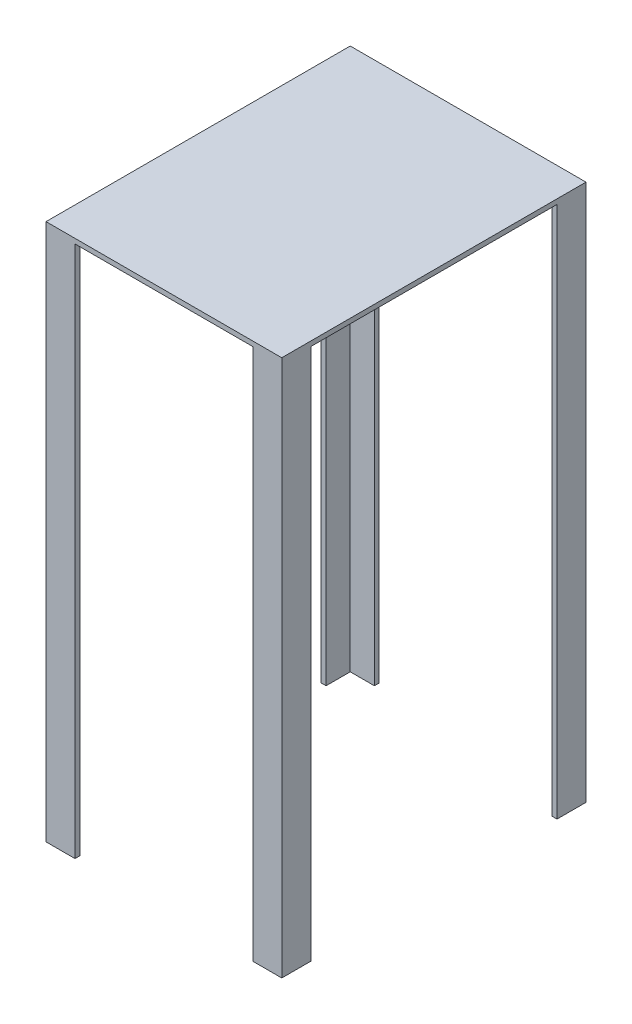
ISO-10303-21;
HEADER;
FILE_DESCRIPTION(('STEP AP214'),'2;1');
FILE_NAME('part.step','',(''),(''),'','','');
FILE_SCHEMA(('AUTOMOTIVE_DESIGN { 1 0 10303 214 1 1 1 1 }'));
ENDSEC;
DATA;
#1=APPLICATION_CONTEXT('core data for automotive mechanical design processes');
#2=APPLICATION_PROTOCOL_DEFINITION('international standard','automotive_design',2000,#1);
#3=PRODUCT_CONTEXT('',#1,'mechanical');
#4=PRODUCT('Part','Part','',(#3));
#5=PRODUCT_RELATED_PRODUCT_CATEGORY('part','',(#4));
#6=PRODUCT_DEFINITION_FORMATION('','',#4);
#7=PRODUCT_DEFINITION_CONTEXT('part definition',#1,'design');
#8=PRODUCT_DEFINITION('design','',#6,#7);
#9=PRODUCT_DEFINITION_SHAPE('','',#8);
#10=(LENGTH_UNIT() NAMED_UNIT(*) SI_UNIT(.MILLI.,.METRE.));
#11=(NAMED_UNIT(*) PLANE_ANGLE_UNIT() SI_UNIT($,.RADIAN.));
#12=(NAMED_UNIT(*) SI_UNIT($,.STERADIAN.) SOLID_ANGLE_UNIT());
#13=UNCERTAINTY_MEASURE_WITH_UNIT(LENGTH_MEASURE(1.E-05),#10,'distance_accuracy_value','');
#14=(GEOMETRIC_REPRESENTATION_CONTEXT(3) GLOBAL_UNCERTAINTY_ASSIGNED_CONTEXT((#13)) GLOBAL_UNIT_ASSIGNED_CONTEXT((#10,
#11,#12)) REPRESENTATION_CONTEXT('',''));
#15=CARTESIAN_POINT('',(0.,0.,0.));
#16=DIRECTION('',(0.,0.,1.));
#17=DIRECTION('',(1.,0.,0.));
#18=AXIS2_PLACEMENT_3D('',#15,#16,#17);
#19=CARTESIAN_POINT('',(0.,-6.35,0.));
#20=DIRECTION('',(0.,-1.,0.));
#21=DIRECTION('',(0.,0.,-1.));
#22=AXIS2_PLACEMENT_3D('',#19,#20,#21);
#23=PLANE('',#22);
#24=DIRECTION('',(-1.,0.,0.));
#25=VECTOR('',#24,1.);
#26=CARTESIAN_POINT('',(6.35,-6.35,-393.65));
#27=LINE('',#26,#25);
#28=CARTESIAN_POINT('',(38.1,-6.35,-393.65));
#29=VERTEX_POINT('',#28);
#30=CARTESIAN_POINT('',(6.35,-6.35,-393.65));
#31=VERTEX_POINT('',#30);
#32=EDGE_CURVE('E383',#29,#31,#27,.T.);
#33=ORIENTED_EDGE('',*,*,#32,.F.);
#34=DIRECTION('',(0.,0.,1.));
#35=VECTOR('',#34,1.);
#36=CARTESIAN_POINT('',(38.1,-6.35,-393.65));
#37=LINE('',#36,#35);
#38=CARTESIAN_POINT('',(38.1,-6.35,-400.));
#39=VERTEX_POINT('',#38);
#40=EDGE_CURVE('E381',#39,#29,#37,.T.);
#41=ORIENTED_EDGE('',*,*,#40,.F.);
#42=DIRECTION('',(-1.,0.,0.));
#43=VECTOR('',#42,1.);
#44=CARTESIAN_POINT('',(0.,-6.35,-400.));
#45=LINE('',#44,#43);
#46=CARTESIAN_POINT('',(271.9,-6.35,-400.));
#47=VERTEX_POINT('',#46);
#48=EDGE_CURVE('E222',#47,#39,#45,.T.);
#49=ORIENTED_EDGE('',*,*,#48,.F.);
#50=DIRECTION('',(0.,0.,-1.));
#51=VECTOR('',#50,1.);
#52=CARTESIAN_POINT('',(271.9,-6.35,-393.65));
#53=LINE('',#52,#51);
#54=CARTESIAN_POINT('',(271.9,-6.35,-393.65));
#55=VERTEX_POINT('',#54);
#56=EDGE_CURVE('E235',#55,#47,#53,.T.);
#57=ORIENTED_EDGE('',*,*,#56,.F.);
#58=DIRECTION('',(-1.,0.,0.));
#59=VECTOR('',#58,1.);
#60=CARTESIAN_POINT('',(303.65,-6.35,-393.65));
#61=LINE('',#60,#59);
#62=CARTESIAN_POINT('',(303.65,-6.35,-393.65));
#63=VERTEX_POINT('',#62);
#64=EDGE_CURVE('E248',#63,#55,#61,.T.);
#65=ORIENTED_EDGE('',*,*,#64,.F.);
#66=DIRECTION('',(0.,0.,-1.));
#67=VECTOR('',#66,1.);
#68=CARTESIAN_POINT('',(303.65,-6.35,-393.65));
#69=LINE('',#68,#67);
#70=CARTESIAN_POINT('',(303.65,-6.35,-361.9));
#71=VERTEX_POINT('',#70);
#72=EDGE_CURVE('E225',#71,#63,#69,.T.);
#73=ORIENTED_EDGE('',*,*,#72,.F.);
#74=DIRECTION('',(-1.,0.,0.));
#75=VECTOR('',#74,1.);
#76=CARTESIAN_POINT('',(303.65,-6.35,-361.9));
#77=LINE('',#76,#75);
#78=CARTESIAN_POINT('',(310.,-6.35,-361.9));
#79=VERTEX_POINT('',#78);
#80=EDGE_CURVE('E223',#79,#71,#77,.T.);
#81=ORIENTED_EDGE('',*,*,#80,.F.);
#82=DIRECTION('',(0.,0.,-1.));
#83=VECTOR('',#82,1.);
#84=CARTESIAN_POINT('',(310.,-6.35,0.));
#85=LINE('',#84,#83);
#86=CARTESIAN_POINT('',(310.,-6.35,-38.1));
#87=VERTEX_POINT('',#86);
#88=EDGE_CURVE('E342',#87,#79,#85,.T.);
#89=ORIENTED_EDGE('',*,*,#88,.F.);
#90=DIRECTION('',(1.,0.,0.));
#91=VECTOR('',#90,1.);
#92=CARTESIAN_POINT('',(303.65,-6.35,-38.1));
#93=LINE('',#92,#91);
#94=CARTESIAN_POINT('',(303.65,-6.35,-38.1));
#95=VERTEX_POINT('',#94);
#96=EDGE_CURVE('E268',#95,#87,#93,.T.);
#97=ORIENTED_EDGE('',*,*,#96,.F.);
#98=DIRECTION('',(0.,0.,-1.));
#99=VECTOR('',#98,1.);
#100=CARTESIAN_POINT('',(303.65,-6.35,-6.35));
#101=LINE('',#100,#99);
#102=CARTESIAN_POINT('',(303.65,-6.35,-6.35));
#103=VERTEX_POINT('',#102);
#104=EDGE_CURVE('E282',#103,#95,#101,.T.);
#105=ORIENTED_EDGE('',*,*,#104,.F.);
#106=DIRECTION('',(1.,0.,0.));
#107=VECTOR('',#106,1.);
#108=CARTESIAN_POINT('',(303.65,-6.35,-6.35));
#109=LINE('',#108,#107);
#110=CARTESIAN_POINT('',(271.9,-6.35,-6.35));
#111=VERTEX_POINT('',#110);
#112=EDGE_CURVE('E280',#111,#103,#109,.T.);
#113=ORIENTED_EDGE('',*,*,#112,.F.);
#114=DIRECTION('',(0.,0.,-1.));
#115=VECTOR('',#114,1.);
#116=CARTESIAN_POINT('',(271.9,-6.35,-6.35));
#117=LINE('',#116,#115);
#118=CARTESIAN_POINT('',(271.9,-6.35,0.));
#119=VERTEX_POINT('',#118);
#120=EDGE_CURVE('E263',#119,#111,#117,.T.);
#121=ORIENTED_EDGE('',*,*,#120,.F.);
#122=DIRECTION('',(1.,0.,0.));
#123=VECTOR('',#122,1.);
#124=CARTESIAN_POINT('',(0.,-6.35,0.));
#125=LINE('',#124,#123);
#126=CARTESIAN_POINT('',(38.1,-6.35,0.));
#127=VERTEX_POINT('',#126);
#128=EDGE_CURVE('E338',#127,#119,#125,.T.);
#129=ORIENTED_EDGE('',*,*,#128,.F.);
#130=DIRECTION('',(0.,0.,1.));
#131=VECTOR('',#130,1.);
#132=CARTESIAN_POINT('',(38.1,-6.35,-6.35));
#133=LINE('',#132,#131);
#134=CARTESIAN_POINT('',(38.1,-6.35,-6.35));
#135=VERTEX_POINT('',#134);
#136=EDGE_CURVE('E58',#135,#127,#133,.T.);
#137=ORIENTED_EDGE('',*,*,#136,.F.);
#138=DIRECTION('',(1.,0.,0.));
#139=VECTOR('',#138,1.);
#140=CARTESIAN_POINT('',(6.35,-6.35,-6.35));
#141=LINE('',#140,#139);
#142=CARTESIAN_POINT('',(6.35,-6.35,-6.35));
#143=VERTEX_POINT('',#142);
#144=EDGE_CURVE('E318',#143,#135,#141,.T.);
#145=ORIENTED_EDGE('',*,*,#144,.F.);
#146=DIRECTION('',(0.,0.,1.));
#147=VECTOR('',#146,1.);
#148=CARTESIAN_POINT('',(6.35,-6.35,-6.35));
#149=LINE('',#148,#147);
#150=CARTESIAN_POINT('',(6.35,-6.35,-38.1));
#151=VERTEX_POINT('',#150);
#152=EDGE_CURVE('E315',#151,#143,#149,.T.);
#153=ORIENTED_EDGE('',*,*,#152,.F.);
#154=DIRECTION('',(1.,0.,0.));
#155=VECTOR('',#154,1.);
#156=CARTESIAN_POINT('',(6.35,-6.35,-38.1));
#157=LINE('',#156,#155);
#158=CARTESIAN_POINT('',(0.,-6.35,-38.1));
#159=VERTEX_POINT('',#158);
#160=EDGE_CURVE('E297',#159,#151,#157,.T.);
#161=ORIENTED_EDGE('',*,*,#160,.F.);
#162=DIRECTION('',(0.,0.,1.));
#163=VECTOR('',#162,1.);
#164=CARTESIAN_POINT('',(0.,-6.35,0.));
#165=LINE('',#164,#163);
#166=CARTESIAN_POINT('',(0.,-6.35,-361.9));
#167=VERTEX_POINT('',#166);
#168=EDGE_CURVE('E336',#167,#159,#165,.T.);
#169=ORIENTED_EDGE('',*,*,#168,.F.);
#170=DIRECTION('',(-1.,0.,0.));
#171=VECTOR('',#170,1.);
#172=CARTESIAN_POINT('',(6.35,-6.35,-361.9));
#173=LINE('',#172,#171);
#174=CARTESIAN_POINT('',(6.35,-6.35,-361.9));
#175=VERTEX_POINT('',#174);
#176=EDGE_CURVE('E215',#175,#167,#173,.T.);
#177=ORIENTED_EDGE('',*,*,#176,.F.);
#178=DIRECTION('',(0.,0.,1.));
#179=VECTOR('',#178,1.);
#180=CARTESIAN_POINT('',(6.35,-6.35,-393.65));
#181=LINE('',#180,#179);
#182=EDGE_CURVE('E385',#31,#175,#181,.T.);
#183=ORIENTED_EDGE('',*,*,#182,.F.);
#184=EDGE_LOOP('',(#33,#41,#49,#57,#65,#73,#81,#89,#97,#105,#113,#121,#129,#137,#145,#153,#161,
#169,#177,#183));
#185=FACE_BOUND('',#184,.T.);
#186=ADVANCED_FACE('F33',(#185),#23,.T.);
#187=CARTESIAN_POINT('',(0.,-6.35,0.));
#188=DIRECTION('',(-1.,0.,0.));
#189=DIRECTION('',(0.,0.,1.));
#190=AXIS2_PLACEMENT_3D('',#187,#188,#189);
#191=PLANE('',#190);
#192=DIRECTION('',(0.,0.,1.));
#193=VECTOR('',#192,1.);
#194=CARTESIAN_POINT('',(0.,0.,0.));
#195=LINE('',#194,#193);
#196=CARTESIAN_POINT('',(0.,0.,-400.));
#197=VERTEX_POINT('',#196);
#198=CARTESIAN_POINT('',(0.,0.,0.));
#199=VERTEX_POINT('',#198);
#200=EDGE_CURVE('E335',#197,#199,#195,.T.);
#201=ORIENTED_EDGE('',*,*,#200,.F.);
#202=DIRECTION('',(0.,1.,0.));
#203=VECTOR('',#202,1.);
#204=CARTESIAN_POINT('',(0.,-6.35,-400.));
#205=LINE('',#204,#203);
#206=CARTESIAN_POINT('',(0.,-706.35,-400.));
#207=VERTEX_POINT('',#206);
#208=EDGE_CURVE('E11',#207,#197,#205,.T.);
#209=ORIENTED_EDGE('',*,*,#208,.F.);
#210=DIRECTION('',(0.,0.,-1.));
#211=VECTOR('',#210,1.);
#212=CARTESIAN_POINT('',(0.,-706.35,-400.));
#213=LINE('',#212,#211);
#214=CARTESIAN_POINT('',(0.,-706.35,-361.9));
#215=VERTEX_POINT('',#214);
#216=EDGE_CURVE('E213',#215,#207,#213,.T.);
#217=ORIENTED_EDGE('',*,*,#216,.F.);
#218=DIRECTION('',(0.,1.,0.));
#219=VECTOR('',#218,1.);
#220=CARTESIAN_POINT('',(0.,-706.35,-361.9));
#221=LINE('',#220,#219);
#222=EDGE_CURVE('E371',#215,#167,#221,.T.);
#223=ORIENTED_EDGE('',*,*,#222,.T.);
#224=ORIENTED_EDGE('',*,*,#168,.T.);
#225=DIRECTION('',(0.,1.,0.));
#226=VECTOR('',#225,1.);
#227=CARTESIAN_POINT('',(0.,-706.35,-38.1));
#228=LINE('',#227,#226);
#229=CARTESIAN_POINT('',(0.,-706.35,-38.1));
#230=VERTEX_POINT('',#229);
#231=EDGE_CURVE('E332',#230,#159,#228,.T.);
#232=ORIENTED_EDGE('',*,*,#231,.F.);
#233=DIRECTION('',(0.,0.,-1.));
#234=VECTOR('',#233,1.);
#235=CARTESIAN_POINT('',(0.,-706.35,0.));
#236=LINE('',#235,#234);
#237=CARTESIAN_POINT('',(0.,-706.35,0.));
#238=VERTEX_POINT('',#237);
#239=EDGE_CURVE('E298',#238,#230,#236,.T.);
#240=ORIENTED_EDGE('',*,*,#239,.F.);
#241=DIRECTION('',(0.,1.,0.));
#242=VECTOR('',#241,1.);
#243=CARTESIAN_POINT('',(0.,-6.35,0.));
#244=LINE('',#243,#242);
#245=EDGE_CURVE('E37',#238,#199,#244,.T.);
#246=ORIENTED_EDGE('',*,*,#245,.T.);
#247=EDGE_LOOP('',(#201,#209,#217,#223,#224,#232,#240,#246));
#248=FACE_BOUND('',#247,.T.);
#249=ADVANCED_FACE('F35',(#248),#191,.T.);
#250=CARTESIAN_POINT('',(0.,-6.35,-400.));
#251=DIRECTION('',(0.,0.,-1.));
#252=DIRECTION('',(-1.,0.,0.));
#253=AXIS2_PLACEMENT_3D('',#250,#251,#252);
#254=PLANE('',#253);
#255=DIRECTION('',(-1.,0.,0.));
#256=VECTOR('',#255,1.);
#257=CARTESIAN_POINT('',(0.,0.,-400.));
#258=LINE('',#257,#256);
#259=CARTESIAN_POINT('',(310.,0.,-400.));
#260=VERTEX_POINT('',#259);
#261=EDGE_CURVE('E339',#260,#197,#258,.T.);
#262=ORIENTED_EDGE('',*,*,#261,.F.);
#263=DIRECTION('',(0.,1.,0.));
#264=VECTOR('',#263,1.);
#265=CARTESIAN_POINT('',(310.,-6.35,-400.));
#266=LINE('',#265,#264);
#267=CARTESIAN_POINT('',(310.,-706.35,-400.));
#268=VERTEX_POINT('',#267);
#269=EDGE_CURVE('E42',#268,#260,#266,.T.);
#270=ORIENTED_EDGE('',*,*,#269,.F.);
#271=DIRECTION('',(1.,0.,0.));
#272=VECTOR('',#271,1.);
#273=CARTESIAN_POINT('',(310.,-706.35,-400.));
#274=LINE('',#273,#272);
#275=CARTESIAN_POINT('',(271.9,-706.35,-400.));
#276=VERTEX_POINT('',#275);
#277=EDGE_CURVE('E243',#276,#268,#274,.T.);
#278=ORIENTED_EDGE('',*,*,#277,.F.);
#279=DIRECTION('',(0.,1.,0.));
#280=VECTOR('',#279,1.);
#281=CARTESIAN_POINT('',(271.9,-706.35,-400.));
#282=LINE('',#281,#280);
#283=EDGE_CURVE('E245',#276,#47,#282,.T.);
#284=ORIENTED_EDGE('',*,*,#283,.T.);
#285=ORIENTED_EDGE('',*,*,#48,.T.);
#286=DIRECTION('',(0.,1.,0.));
#287=VECTOR('',#286,1.);
#288=CARTESIAN_POINT('',(38.1,-706.35,-400.));
#289=LINE('',#288,#287);
#290=CARTESIAN_POINT('',(38.1,-706.35,-400.));
#291=VERTEX_POINT('',#290);
#292=EDGE_CURVE('E200',#291,#39,#289,.T.);
#293=ORIENTED_EDGE('',*,*,#292,.F.);
#294=DIRECTION('',(1.,0.,0.));
#295=VECTOR('',#294,1.);
#296=CARTESIAN_POINT('',(0.,-706.35,-400.));
#297=LINE('',#296,#295);
#298=EDGE_CURVE('E207',#207,#291,#297,.T.);
#299=ORIENTED_EDGE('',*,*,#298,.F.);
#300=ORIENTED_EDGE('',*,*,#208,.T.);
#301=EDGE_LOOP('',(#262,#270,#278,#284,#285,#293,#299,#300));
#302=FACE_BOUND('',#301,.T.);
#303=ADVANCED_FACE('F219',(#302),#254,.T.);
#304=CARTESIAN_POINT('',(310.,-6.35,0.));
#305=DIRECTION('',(1.,0.,0.));
#306=DIRECTION('',(0.,0.,-1.));
#307=AXIS2_PLACEMENT_3D('',#304,#305,#306);
#308=PLANE('',#307);
#309=DIRECTION('',(0.,0.,-1.));
#310=VECTOR('',#309,1.);
#311=CARTESIAN_POINT('',(310.,0.,0.));
#312=LINE('',#311,#310);
#313=CARTESIAN_POINT('',(310.,0.,0.));
#314=VERTEX_POINT('',#313);
#315=EDGE_CURVE('E350',#314,#260,#312,.T.);
#316=ORIENTED_EDGE('',*,*,#315,.F.);
#317=DIRECTION('',(0.,1.,0.));
#318=VECTOR('',#317,1.);
#319=CARTESIAN_POINT('',(310.,-6.35,0.));
#320=LINE('',#319,#318);
#321=CARTESIAN_POINT('',(310.,-706.35,0.));
#322=VERTEX_POINT('',#321);
#323=EDGE_CURVE('E355',#322,#314,#320,.T.);
#324=ORIENTED_EDGE('',*,*,#323,.F.);
#325=DIRECTION('',(0.,0.,1.));
#326=VECTOR('',#325,1.);
#327=CARTESIAN_POINT('',(310.,-706.35,0.));
#328=LINE('',#327,#326);
#329=CARTESIAN_POINT('',(310.,-706.35,-38.1));
#330=VERTEX_POINT('',#329);
#331=EDGE_CURVE('E276',#330,#322,#328,.T.);
#332=ORIENTED_EDGE('',*,*,#331,.F.);
#333=DIRECTION('',(0.,1.,0.));
#334=VECTOR('',#333,1.);
#335=CARTESIAN_POINT('',(310.,-706.35,-38.1));
#336=LINE('',#335,#334);
#337=EDGE_CURVE('E50',#330,#87,#336,.T.);
#338=ORIENTED_EDGE('',*,*,#337,.T.);
#339=ORIENTED_EDGE('',*,*,#88,.T.);
#340=DIRECTION('',(0.,1.,0.));
#341=VECTOR('',#340,1.);
#342=CARTESIAN_POINT('',(310.,-706.35,-361.9));
#343=LINE('',#342,#341);
#344=CARTESIAN_POINT('',(310.,-706.35,-361.9));
#345=VERTEX_POINT('',#344);
#346=EDGE_CURVE('E261',#345,#79,#343,.T.);
#347=ORIENTED_EDGE('',*,*,#346,.F.);
#348=DIRECTION('',(0.,0.,1.));
#349=VECTOR('',#348,1.);
#350=CARTESIAN_POINT('',(310.,-706.35,-400.));
#351=LINE('',#350,#349);
#352=EDGE_CURVE('E231',#268,#345,#351,.T.);
#353=ORIENTED_EDGE('',*,*,#352,.F.);
#354=ORIENTED_EDGE('',*,*,#269,.T.);
#355=EDGE_LOOP('',(#316,#324,#332,#338,#339,#347,#353,#354));
#356=FACE_BOUND('',#355,.T.);
#357=ADVANCED_FACE('F427',(#356),#308,.T.);
#358=CARTESIAN_POINT('',(0.,-6.35,0.));
#359=DIRECTION('',(0.,0.,1.));
#360=DIRECTION('',(1.,0.,0.));
#361=AXIS2_PLACEMENT_3D('',#358,#359,#360);
#362=PLANE('',#361);
#363=DIRECTION('',(1.,0.,0.));
#364=VECTOR('',#363,1.);
#365=CARTESIAN_POINT('',(0.,0.,0.));
#366=LINE('',#365,#364);
#367=EDGE_CURVE('E347',#199,#314,#366,.T.);
#368=ORIENTED_EDGE('',*,*,#367,.F.);
#369=ORIENTED_EDGE('',*,*,#245,.F.);
#370=DIRECTION('',(-1.,0.,0.));
#371=VECTOR('',#370,1.);
#372=CARTESIAN_POINT('',(0.,-706.35,0.));
#373=LINE('',#372,#371);
#374=CARTESIAN_POINT('',(38.1,-706.35,0.));
#375=VERTEX_POINT('',#374);
#376=EDGE_CURVE('E309',#375,#238,#373,.T.);
#377=ORIENTED_EDGE('',*,*,#376,.F.);
#378=DIRECTION('',(0.,1.,0.));
#379=VECTOR('',#378,1.);
#380=CARTESIAN_POINT('',(38.1,-706.35,0.));
#381=LINE('',#380,#379);
#382=EDGE_CURVE('E312',#375,#127,#381,.T.);
#383=ORIENTED_EDGE('',*,*,#382,.T.);
#384=ORIENTED_EDGE('',*,*,#128,.T.);
#385=DIRECTION('',(0.,1.,0.));
#386=VECTOR('',#385,1.);
#387=CARTESIAN_POINT('',(271.9,-706.35,0.));
#388=LINE('',#387,#386);
#389=CARTESIAN_POINT('',(271.9,-706.35,0.));
#390=VERTEX_POINT('',#389);
#391=EDGE_CURVE('E295',#390,#119,#388,.T.);
#392=ORIENTED_EDGE('',*,*,#391,.F.);
#393=DIRECTION('',(-1.,0.,0.));
#394=VECTOR('',#393,1.);
#395=CARTESIAN_POINT('',(310.,-706.35,0.));
#396=LINE('',#395,#394);
#397=EDGE_CURVE('E264',#322,#390,#396,.T.);
#398=ORIENTED_EDGE('',*,*,#397,.F.);
#399=ORIENTED_EDGE('',*,*,#323,.T.);
#400=EDGE_LOOP('',(#368,#369,#377,#383,#384,#392,#398,#399));
#401=FACE_BOUND('',#400,.T.);
#402=ADVANCED_FACE('F365',(#401),#362,.T.);
#403=CARTESIAN_POINT('',(0.,0.,0.));
#404=DIRECTION('',(0.,-1.,0.));
#405=DIRECTION('',(0.,0.,-1.));
#406=AXIS2_PLACEMENT_3D('',#403,#404,#405);
#407=PLANE('',#406);
#408=ORIENTED_EDGE('',*,*,#200,.T.);
#409=ORIENTED_EDGE('',*,*,#367,.T.);
#410=ORIENTED_EDGE('',*,*,#315,.T.);
#411=ORIENTED_EDGE('',*,*,#261,.T.);
#412=EDGE_LOOP('',(#408,#409,#410,#411));
#413=FACE_BOUND('',#412,.T.);
#414=ADVANCED_FACE('F367',(#413),#407,.F.);
#415=CARTESIAN_POINT('',(6.35,-706.35,-38.1));
#416=DIRECTION('',(0.,0.,1.));
#417=DIRECTION('',(1.,0.,0.));
#418=AXIS2_PLACEMENT_3D('',#415,#416,#417);
#419=PLANE('',#418);
#420=ORIENTED_EDGE('',*,*,#160,.T.);
#421=DIRECTION('',(0.,1.,0.));
#422=VECTOR('',#421,1.);
#423=CARTESIAN_POINT('',(6.35,-706.35,-38.1));
#424=LINE('',#423,#422);
#425=CARTESIAN_POINT('',(6.35,-706.35,-38.1));
#426=VERTEX_POINT('',#425);
#427=EDGE_CURVE('E329',#426,#151,#424,.T.);
#428=ORIENTED_EDGE('',*,*,#427,.F.);
#429=DIRECTION('',(1.,0.,0.));
#430=VECTOR('',#429,1.);
#431=CARTESIAN_POINT('',(6.35,-706.35,-38.1));
#432=LINE('',#431,#430);
#433=EDGE_CURVE('E301',#230,#426,#432,.T.);
#434=ORIENTED_EDGE('',*,*,#433,.F.);
#435=ORIENTED_EDGE('',*,*,#231,.T.);
#436=EDGE_LOOP('',(#420,#428,#434,#435));
#437=FACE_BOUND('',#436,.T.);
#438=ADVANCED_FACE('F421',(#437),#419,.F.);
#439=CARTESIAN_POINT('',(6.35,-706.35,-6.35));
#440=DIRECTION('',(-1.,0.,0.));
#441=DIRECTION('',(0.,0.,1.));
#442=AXIS2_PLACEMENT_3D('',#439,#440,#441);
#443=PLANE('',#442);
#444=ORIENTED_EDGE('',*,*,#152,.T.);
#445=DIRECTION('',(0.,1.,0.));
#446=VECTOR('',#445,1.);
#447=CARTESIAN_POINT('',(6.35,-706.35,-6.35));
#448=LINE('',#447,#446);
#449=CARTESIAN_POINT('',(6.35,-706.35,-6.35));
#450=VERTEX_POINT('',#449);
#451=EDGE_CURVE('E326',#450,#143,#448,.T.);
#452=ORIENTED_EDGE('',*,*,#451,.F.);
#453=DIRECTION('',(0.,0.,1.));
#454=VECTOR('',#453,1.);
#455=CARTESIAN_POINT('',(6.35,-706.35,-6.35));
#456=LINE('',#455,#454);
#457=EDGE_CURVE('E303',#426,#450,#456,.T.);
#458=ORIENTED_EDGE('',*,*,#457,.F.);
#459=ORIENTED_EDGE('',*,*,#427,.T.);
#460=EDGE_LOOP('',(#444,#452,#458,#459));
#461=FACE_BOUND('',#460,.T.);
#462=ADVANCED_FACE('F444',(#461),#443,.F.);
#463=CARTESIAN_POINT('',(6.35,-706.35,-6.35));
#464=DIRECTION('',(0.,0.,1.));
#465=DIRECTION('',(1.,0.,0.));
#466=AXIS2_PLACEMENT_3D('',#463,#464,#465);
#467=PLANE('',#466);
#468=ORIENTED_EDGE('',*,*,#144,.T.);
#469=DIRECTION('',(0.,1.,0.));
#470=VECTOR('',#469,1.);
#471=CARTESIAN_POINT('',(38.1,-706.35,-6.35));
#472=LINE('',#471,#470);
#473=CARTESIAN_POINT('',(38.1,-706.35,-6.35));
#474=VERTEX_POINT('',#473);
#475=EDGE_CURVE('E323',#474,#135,#472,.T.);
#476=ORIENTED_EDGE('',*,*,#475,.F.);
#477=DIRECTION('',(1.,0.,0.));
#478=VECTOR('',#477,1.);
#479=CARTESIAN_POINT('',(6.35,-706.35,-6.35));
#480=LINE('',#479,#478);
#481=EDGE_CURVE('E305',#450,#474,#480,.T.);
#482=ORIENTED_EDGE('',*,*,#481,.F.);
#483=ORIENTED_EDGE('',*,*,#451,.T.);
#484=EDGE_LOOP('',(#468,#476,#482,#483));
#485=FACE_BOUND('',#484,.T.);
#486=ADVANCED_FACE('F451',(#485),#467,.F.);
#487=CARTESIAN_POINT('',(38.1,-706.35,-6.35));
#488=DIRECTION('',(-1.,0.,0.));
#489=DIRECTION('',(0.,0.,1.));
#490=AXIS2_PLACEMENT_3D('',#487,#488,#489);
#491=PLANE('',#490);
#492=ORIENTED_EDGE('',*,*,#136,.T.);
#493=ORIENTED_EDGE('',*,*,#382,.F.);
#494=DIRECTION('',(0.,0.,1.));
#495=VECTOR('',#494,1.);
#496=CARTESIAN_POINT('',(38.1,-706.35,-6.35));
#497=LINE('',#496,#495);
#498=EDGE_CURVE('E307',#474,#375,#497,.T.);
#499=ORIENTED_EDGE('',*,*,#498,.F.);
#500=ORIENTED_EDGE('',*,*,#475,.T.);
#501=EDGE_LOOP('',(#492,#493,#499,#500));
#502=FACE_BOUND('',#501,.T.);
#503=ADVANCED_FACE('F458',(#502),#491,.F.);
#504=CARTESIAN_POINT('',(0.,-706.35,0.));
#505=DIRECTION('',(0.,1.,0.));
#506=DIRECTION('',(0.,0.,1.));
#507=AXIS2_PLACEMENT_3D('',#504,#505,#506);
#508=PLANE('',#507);
#509=ORIENTED_EDGE('',*,*,#239,.T.);
#510=ORIENTED_EDGE('',*,*,#433,.T.);
#511=ORIENTED_EDGE('',*,*,#457,.T.);
#512=ORIENTED_EDGE('',*,*,#481,.T.);
#513=ORIENTED_EDGE('',*,*,#498,.T.);
#514=ORIENTED_EDGE('',*,*,#376,.T.);
#515=EDGE_LOOP('',(#509,#510,#511,#512,#513,#514));
#516=FACE_BOUND('',#515,.T.);
#517=ADVANCED_FACE('F466',(#516),#508,.F.);
#518=CARTESIAN_POINT('',(271.9,-706.35,-6.35));
#519=DIRECTION('',(1.,0.,0.));
#520=DIRECTION('',(0.,0.,-1.));
#521=AXIS2_PLACEMENT_3D('',#518,#519,#520);
#522=PLANE('',#521);
#523=ORIENTED_EDGE('',*,*,#120,.T.);
#524=DIRECTION('',(0.,1.,0.));
#525=VECTOR('',#524,1.);
#526=CARTESIAN_POINT('',(271.9,-706.35,-6.35));
#527=LINE('',#526,#525);
#528=CARTESIAN_POINT('',(271.9,-706.35,-6.35));
#529=VERTEX_POINT('',#528);
#530=EDGE_CURVE('E292',#529,#111,#527,.T.);
#531=ORIENTED_EDGE('',*,*,#530,.F.);
#532=DIRECTION('',(0.,0.,-1.));
#533=VECTOR('',#532,1.);
#534=CARTESIAN_POINT('',(271.9,-706.35,-6.35));
#535=LINE('',#534,#533);
#536=EDGE_CURVE('E267',#390,#529,#535,.T.);
#537=ORIENTED_EDGE('',*,*,#536,.F.);
#538=ORIENTED_EDGE('',*,*,#391,.T.);
#539=EDGE_LOOP('',(#523,#531,#537,#538));
#540=FACE_BOUND('',#539,.T.);
#541=ADVANCED_FACE('F474',(#540),#522,.F.);
#542=CARTESIAN_POINT('',(303.65,-706.35,-6.35));
#543=DIRECTION('',(0.,0.,1.));
#544=DIRECTION('',(1.,0.,0.));
#545=AXIS2_PLACEMENT_3D('',#542,#543,#544);
#546=PLANE('',#545);
#547=ORIENTED_EDGE('',*,*,#112,.T.);
#548=DIRECTION('',(0.,1.,0.));
#549=VECTOR('',#548,1.);
#550=CARTESIAN_POINT('',(303.65,-706.35,-6.35));
#551=LINE('',#550,#549);
#552=CARTESIAN_POINT('',(303.65,-706.35,-6.35));
#553=VERTEX_POINT('',#552);
#554=EDGE_CURVE('E289',#553,#103,#551,.T.);
#555=ORIENTED_EDGE('',*,*,#554,.F.);
#556=DIRECTION('',(1.,0.,0.));
#557=VECTOR('',#556,1.);
#558=CARTESIAN_POINT('',(303.65,-706.35,-6.35));
#559=LINE('',#558,#557);
#560=EDGE_CURVE('E270',#529,#553,#559,.T.);
#561=ORIENTED_EDGE('',*,*,#560,.F.);
#562=ORIENTED_EDGE('',*,*,#530,.T.);
#563=EDGE_LOOP('',(#547,#555,#561,#562));
#564=FACE_BOUND('',#563,.T.);
#565=ADVANCED_FACE('F482',(#564),#546,.F.);
#566=CARTESIAN_POINT('',(303.65,-706.35,-6.35));
#567=DIRECTION('',(1.,0.,0.));
#568=DIRECTION('',(0.,0.,-1.));
#569=AXIS2_PLACEMENT_3D('',#566,#567,#568);
#570=PLANE('',#569);
#571=ORIENTED_EDGE('',*,*,#104,.T.);
#572=DIRECTION('',(0.,1.,0.));
#573=VECTOR('',#572,1.);
#574=CARTESIAN_POINT('',(303.65,-706.35,-38.1));
#575=LINE('',#574,#573);
#576=CARTESIAN_POINT('',(303.65,-706.35,-38.1));
#577=VERTEX_POINT('',#576);
#578=EDGE_CURVE('E286',#577,#95,#575,.T.);
#579=ORIENTED_EDGE('',*,*,#578,.F.);
#580=DIRECTION('',(0.,0.,-1.));
#581=VECTOR('',#580,1.);
#582=CARTESIAN_POINT('',(303.65,-706.35,-6.35));
#583=LINE('',#582,#581);
#584=EDGE_CURVE('E272',#553,#577,#583,.T.);
#585=ORIENTED_EDGE('',*,*,#584,.F.);
#586=ORIENTED_EDGE('',*,*,#554,.T.);
#587=EDGE_LOOP('',(#571,#579,#585,#586));
#588=FACE_BOUND('',#587,.T.);
#589=ADVANCED_FACE('F490',(#588),#570,.F.);
#590=CARTESIAN_POINT('',(303.65,-706.35,-38.1));
#591=DIRECTION('',(0.,0.,1.));
#592=DIRECTION('',(1.,0.,0.));
#593=AXIS2_PLACEMENT_3D('',#590,#591,#592);
#594=PLANE('',#593);
#595=ORIENTED_EDGE('',*,*,#96,.T.);
#596=ORIENTED_EDGE('',*,*,#337,.F.);
#597=DIRECTION('',(1.,0.,0.));
#598=VECTOR('',#597,1.);
#599=CARTESIAN_POINT('',(303.65,-706.35,-38.1));
#600=LINE('',#599,#598);
#601=EDGE_CURVE('E274',#577,#330,#600,.T.);
#602=ORIENTED_EDGE('',*,*,#601,.F.);
#603=ORIENTED_EDGE('',*,*,#578,.T.);
#604=EDGE_LOOP('',(#595,#596,#602,#603));
#605=FACE_BOUND('',#604,.T.);
#606=ADVANCED_FACE('F498',(#605),#594,.F.);
#607=CARTESIAN_POINT('',(0.,-706.35,0.));
#608=DIRECTION('',(0.,1.,0.));
#609=DIRECTION('',(0.,0.,1.));
#610=AXIS2_PLACEMENT_3D('',#607,#608,#609);
#611=PLANE('',#610);
#612=ORIENTED_EDGE('',*,*,#397,.T.);
#613=ORIENTED_EDGE('',*,*,#536,.T.);
#614=ORIENTED_EDGE('',*,*,#560,.T.);
#615=ORIENTED_EDGE('',*,*,#584,.T.);
#616=ORIENTED_EDGE('',*,*,#601,.T.);
#617=ORIENTED_EDGE('',*,*,#331,.T.);
#618=EDGE_LOOP('',(#612,#613,#614,#615,#616,#617));
#619=FACE_BOUND('',#618,.T.);
#620=ADVANCED_FACE('F506',(#619),#611,.F.);
#621=CARTESIAN_POINT('',(303.65,-706.35,-361.9));
#622=DIRECTION('',(0.,0.,-1.));
#623=DIRECTION('',(-1.,0.,0.));
#624=AXIS2_PLACEMENT_3D('',#621,#622,#623);
#625=PLANE('',#624);
#626=ORIENTED_EDGE('',*,*,#80,.T.);
#627=DIRECTION('',(0.,1.,0.));
#628=VECTOR('',#627,1.);
#629=CARTESIAN_POINT('',(303.65,-706.35,-361.9));
#630=LINE('',#629,#628);
#631=CARTESIAN_POINT('',(303.65,-706.35,-361.9));
#632=VERTEX_POINT('',#631);
#633=EDGE_CURVE('E258',#632,#71,#630,.T.);
#634=ORIENTED_EDGE('',*,*,#633,.F.);
#635=DIRECTION('',(-1.,0.,0.));
#636=VECTOR('',#635,1.);
#637=CARTESIAN_POINT('',(303.65,-706.35,-361.9));
#638=LINE('',#637,#636);
#639=EDGE_CURVE('E234',#345,#632,#638,.T.);
#640=ORIENTED_EDGE('',*,*,#639,.F.);
#641=ORIENTED_EDGE('',*,*,#346,.T.);
#642=EDGE_LOOP('',(#626,#634,#640,#641));
#643=FACE_BOUND('',#642,.T.);
#644=ADVANCED_FACE('F514',(#643),#625,.F.);
#645=CARTESIAN_POINT('',(303.65,-706.35,-393.65));
#646=DIRECTION('',(1.,0.,0.));
#647=DIRECTION('',(0.,0.,-1.));
#648=AXIS2_PLACEMENT_3D('',#645,#646,#647);
#649=PLANE('',#648);
#650=ORIENTED_EDGE('',*,*,#72,.T.);
#651=DIRECTION('',(0.,1.,0.));
#652=VECTOR('',#651,1.);
#653=CARTESIAN_POINT('',(303.65,-706.35,-393.65));
#654=LINE('',#653,#652);
#655=CARTESIAN_POINT('',(303.65,-706.35,-393.65));
#656=VERTEX_POINT('',#655);
#657=EDGE_CURVE('E255',#656,#63,#654,.T.);
#658=ORIENTED_EDGE('',*,*,#657,.F.);
#659=DIRECTION('',(0.,0.,-1.));
#660=VECTOR('',#659,1.);
#661=CARTESIAN_POINT('',(303.65,-706.35,-393.65));
#662=LINE('',#661,#660);
#663=EDGE_CURVE('E237',#632,#656,#662,.T.);
#664=ORIENTED_EDGE('',*,*,#663,.F.);
#665=ORIENTED_EDGE('',*,*,#633,.T.);
#666=EDGE_LOOP('',(#650,#658,#664,#665));
#667=FACE_BOUND('',#666,.T.);
#668=ADVANCED_FACE('F522',(#667),#649,.F.);
#669=CARTESIAN_POINT('',(303.65,-706.35,-393.65));
#670=DIRECTION('',(0.,0.,-1.));
#671=DIRECTION('',(-1.,0.,0.));
#672=AXIS2_PLACEMENT_3D('',#669,#670,#671);
#673=PLANE('',#672);
#674=ORIENTED_EDGE('',*,*,#64,.T.);
#675=DIRECTION('',(0.,1.,0.));
#676=VECTOR('',#675,1.);
#677=CARTESIAN_POINT('',(271.9,-706.35,-393.65));
#678=LINE('',#677,#676);
#679=CARTESIAN_POINT('',(271.9,-706.35,-393.65));
#680=VERTEX_POINT('',#679);
#681=EDGE_CURVE('E252',#680,#55,#678,.T.);
#682=ORIENTED_EDGE('',*,*,#681,.F.);
#683=DIRECTION('',(-1.,0.,0.));
#684=VECTOR('',#683,1.);
#685=CARTESIAN_POINT('',(303.65,-706.35,-393.65));
#686=LINE('',#685,#684);
#687=EDGE_CURVE('E239',#656,#680,#686,.T.);
#688=ORIENTED_EDGE('',*,*,#687,.F.);
#689=ORIENTED_EDGE('',*,*,#657,.T.);
#690=EDGE_LOOP('',(#674,#682,#688,#689));
#691=FACE_BOUND('',#690,.T.);
#692=ADVANCED_FACE('F530',(#691),#673,.F.);
#693=CARTESIAN_POINT('',(271.9,-706.35,-393.65));
#694=DIRECTION('',(1.,0.,0.));
#695=DIRECTION('',(0.,0.,-1.));
#696=AXIS2_PLACEMENT_3D('',#693,#694,#695);
#697=PLANE('',#696);
#698=ORIENTED_EDGE('',*,*,#56,.T.);
#699=ORIENTED_EDGE('',*,*,#283,.F.);
#700=DIRECTION('',(0.,0.,-1.));
#701=VECTOR('',#700,1.);
#702=CARTESIAN_POINT('',(271.9,-706.35,-393.65));
#703=LINE('',#702,#701);
#704=EDGE_CURVE('E241',#680,#276,#703,.T.);
#705=ORIENTED_EDGE('',*,*,#704,.F.);
#706=ORIENTED_EDGE('',*,*,#681,.T.);
#707=EDGE_LOOP('',(#698,#699,#705,#706));
#708=FACE_BOUND('',#707,.T.);
#709=ADVANCED_FACE('F538',(#708),#697,.F.);
#710=CARTESIAN_POINT('',(0.,-706.35,0.));
#711=DIRECTION('',(0.,1.,0.));
#712=DIRECTION('',(0.,0.,1.));
#713=AXIS2_PLACEMENT_3D('',#710,#711,#712);
#714=PLANE('',#713);
#715=ORIENTED_EDGE('',*,*,#352,.T.);
#716=ORIENTED_EDGE('',*,*,#639,.T.);
#717=ORIENTED_EDGE('',*,*,#663,.T.);
#718=ORIENTED_EDGE('',*,*,#687,.T.);
#719=ORIENTED_EDGE('',*,*,#704,.T.);
#720=ORIENTED_EDGE('',*,*,#277,.T.);
#721=EDGE_LOOP('',(#715,#716,#717,#718,#719,#720));
#722=FACE_BOUND('',#721,.T.);
#723=ADVANCED_FACE('F412',(#722),#714,.F.);
#724=CARTESIAN_POINT('',(38.1,-706.35,-393.65));
#725=DIRECTION('',(-1.,0.,0.));
#726=DIRECTION('',(0.,0.,1.));
#727=AXIS2_PLACEMENT_3D('',#724,#725,#726);
#728=PLANE('',#727);
#729=ORIENTED_EDGE('',*,*,#40,.T.);
#730=DIRECTION('',(0.,1.,0.));
#731=VECTOR('',#730,1.);
#732=CARTESIAN_POINT('',(38.1,-706.35,-393.65));
#733=LINE('',#732,#731);
#734=CARTESIAN_POINT('',(38.1,-706.35,-393.65));
#735=VERTEX_POINT('',#734);
#736=EDGE_CURVE('E203',#735,#29,#733,.T.);
#737=ORIENTED_EDGE('',*,*,#736,.F.);
#738=DIRECTION('',(0.,0.,1.));
#739=VECTOR('',#738,1.);
#740=CARTESIAN_POINT('',(38.1,-706.35,-393.65));
#741=LINE('',#740,#739);
#742=EDGE_CURVE('E196',#291,#735,#741,.T.);
#743=ORIENTED_EDGE('',*,*,#742,.F.);
#744=ORIENTED_EDGE('',*,*,#292,.T.);
#745=EDGE_LOOP('',(#729,#737,#743,#744));
#746=FACE_BOUND('',#745,.T.);
#747=ADVANCED_FACE('F198',(#746),#728,.F.);
#748=CARTESIAN_POINT('',(6.35,-706.35,-393.65));
#749=DIRECTION('',(0.,0.,-1.));
#750=DIRECTION('',(-1.,0.,0.));
#751=AXIS2_PLACEMENT_3D('',#748,#749,#750);
#752=PLANE('',#751);
#753=ORIENTED_EDGE('',*,*,#32,.T.);
#754=DIRECTION('',(0.,1.,0.));
#755=VECTOR('',#754,1.);
#756=CARTESIAN_POINT('',(6.35,-706.35,-393.65));
#757=LINE('',#756,#755);
#758=CARTESIAN_POINT('',(6.35,-706.35,-393.65));
#759=VERTEX_POINT('',#758);
#760=EDGE_CURVE('E227',#759,#31,#757,.T.);
#761=ORIENTED_EDGE('',*,*,#760,.F.);
#762=DIRECTION('',(-1.,0.,0.));
#763=VECTOR('',#762,1.);
#764=CARTESIAN_POINT('',(6.35,-706.35,-393.65));
#765=LINE('',#764,#763);
#766=EDGE_CURVE('E206',#735,#759,#765,.T.);
#767=ORIENTED_EDGE('',*,*,#766,.F.);
#768=ORIENTED_EDGE('',*,*,#736,.T.);
#769=EDGE_LOOP('',(#753,#761,#767,#768));
#770=FACE_BOUND('',#769,.T.);
#771=ADVANCED_FACE('F404',(#770),#752,.F.);
#772=CARTESIAN_POINT('',(6.35,-706.35,-393.65));
#773=DIRECTION('',(-1.,0.,0.));
#774=DIRECTION('',(0.,0.,1.));
#775=AXIS2_PLACEMENT_3D('',#772,#773,#774);
#776=PLANE('',#775);
#777=ORIENTED_EDGE('',*,*,#182,.T.);
#778=DIRECTION('',(0.,1.,0.));
#779=VECTOR('',#778,1.);
#780=CARTESIAN_POINT('',(6.35,-706.35,-361.9));
#781=LINE('',#780,#779);
#782=CARTESIAN_POINT('',(6.35,-706.35,-361.9));
#783=VERTEX_POINT('',#782);
#784=EDGE_CURVE('E375',#783,#175,#781,.T.);
#785=ORIENTED_EDGE('',*,*,#784,.F.);
#786=DIRECTION('',(0.,0.,1.));
#787=VECTOR('',#786,1.);
#788=CARTESIAN_POINT('',(6.35,-706.35,-393.65));
#789=LINE('',#788,#787);
#790=EDGE_CURVE('E377',#759,#783,#789,.T.);
#791=ORIENTED_EDGE('',*,*,#790,.F.);
#792=ORIENTED_EDGE('',*,*,#760,.T.);
#793=EDGE_LOOP('',(#777,#785,#791,#792));
#794=FACE_BOUND('',#793,.T.);
#795=ADVANCED_FACE('F394',(#794),#776,.F.);
#796=CARTESIAN_POINT('',(6.35,-706.35,-361.9));
#797=DIRECTION('',(0.,0.,-1.));
#798=DIRECTION('',(-1.,0.,0.));
#799=AXIS2_PLACEMENT_3D('',#796,#797,#798);
#800=PLANE('',#799);
#801=ORIENTED_EDGE('',*,*,#176,.T.);
#802=ORIENTED_EDGE('',*,*,#222,.F.);
#803=DIRECTION('',(-1.,0.,0.));
#804=VECTOR('',#803,1.);
#805=CARTESIAN_POINT('',(6.35,-706.35,-361.9));
#806=LINE('',#805,#804);
#807=EDGE_CURVE('E373',#783,#215,#806,.T.);
#808=ORIENTED_EDGE('',*,*,#807,.F.);
#809=ORIENTED_EDGE('',*,*,#784,.T.);
#810=EDGE_LOOP('',(#801,#802,#808,#809));
#811=FACE_BOUND('',#810,.T.);
#812=ADVANCED_FACE('F401',(#811),#800,.F.);
#813=CARTESIAN_POINT('',(0.,-706.35,0.));
#814=DIRECTION('',(0.,1.,0.));
#815=DIRECTION('',(0.,0.,1.));
#816=AXIS2_PLACEMENT_3D('',#813,#814,#815);
#817=PLANE('',#816);
#818=ORIENTED_EDGE('',*,*,#298,.T.);
#819=ORIENTED_EDGE('',*,*,#742,.T.);
#820=ORIENTED_EDGE('',*,*,#766,.T.);
#821=ORIENTED_EDGE('',*,*,#790,.T.);
#822=ORIENTED_EDGE('',*,*,#807,.T.);
#823=ORIENTED_EDGE('',*,*,#216,.T.);
#824=EDGE_LOOP('',(#818,#819,#820,#821,#822,#823));
#825=FACE_BOUND('',#824,.T.);
#826=ADVANCED_FACE('F211',(#825),#817,.F.);
#827=CLOSED_SHELL('',(#186,#249,#303,#357,#402,#414,#438,#462,#486,#503,#517,#541,#565,#589,
#606,#620,#644,#668,#692,#709,#723,#747,#771,#795,#812,#826));
#828=MANIFOLD_SOLID_BREP('B2',#827);
#829=ADVANCED_BREP_SHAPE_REPRESENTATION('',(#18,#828),#14);
#830=SHAPE_DEFINITION_REPRESENTATION(#9,#829);
ENDSEC;
END-ISO-10303-21;
